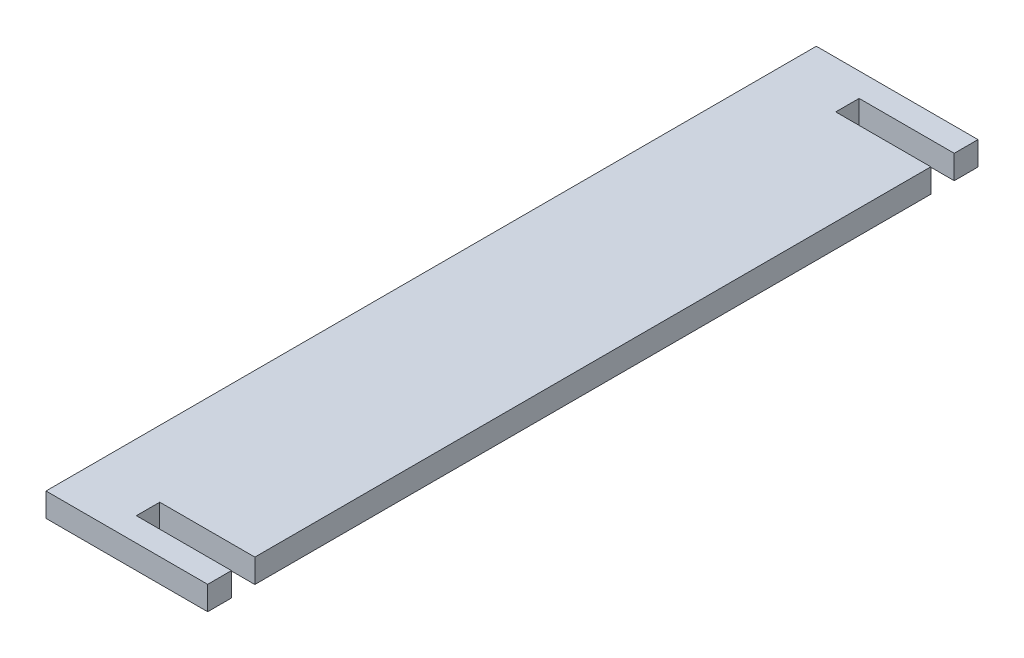
ISO-10303-21;
HEADER;
FILE_DESCRIPTION(('STEP AP214'),'2;1');
FILE_NAME('part.step','',(''),(''),'','','');
FILE_SCHEMA(('AUTOMOTIVE_DESIGN { 1 0 10303 214 1 1 1 1 }'));
ENDSEC;
DATA;
#1=APPLICATION_CONTEXT('core data for automotive mechanical design processes');
#2=APPLICATION_PROTOCOL_DEFINITION('international standard','automotive_design',2000,#1);
#3=PRODUCT_CONTEXT('',#1,'mechanical');
#4=PRODUCT('Part','Part','',(#3));
#5=PRODUCT_RELATED_PRODUCT_CATEGORY('part','',(#4));
#6=PRODUCT_DEFINITION_FORMATION('','',#4);
#7=PRODUCT_DEFINITION_CONTEXT('part definition',#1,'design');
#8=PRODUCT_DEFINITION('design','',#6,#7);
#9=PRODUCT_DEFINITION_SHAPE('','',#8);
#10=(LENGTH_UNIT() NAMED_UNIT(*) SI_UNIT(.MILLI.,.METRE.));
#11=(NAMED_UNIT(*) PLANE_ANGLE_UNIT() SI_UNIT($,.RADIAN.));
#12=(NAMED_UNIT(*) SI_UNIT($,.STERADIAN.) SOLID_ANGLE_UNIT());
#13=UNCERTAINTY_MEASURE_WITH_UNIT(LENGTH_MEASURE(1.E-05),#10,'distance_accuracy_value','');
#14=(GEOMETRIC_REPRESENTATION_CONTEXT(3) GLOBAL_UNCERTAINTY_ASSIGNED_CONTEXT((#13)) GLOBAL_UNIT_ASSIGNED_CONTEXT((#10,
#11,#12)) REPRESENTATION_CONTEXT('',''));
#15=CARTESIAN_POINT('',(0.,0.,0.));
#16=DIRECTION('',(0.,0.,1.));
#17=DIRECTION('',(1.,0.,0.));
#18=AXIS2_PLACEMENT_3D('',#15,#16,#17);
#19=CARTESIAN_POINT('',(0.,3.175,-102.87));
#20=DIRECTION('',(1.,0.,0.));
#21=DIRECTION('',(0.,0.,-1.));
#22=AXIS2_PLACEMENT_3D('',#19,#20,#21);
#23=PLANE('',#22);
#24=DIRECTION('',(0.,0.,1.));
#25=VECTOR('',#24,1.);
#26=CARTESIAN_POINT('',(0.,0.,-102.87));
#27=LINE('',#26,#25);
#28=CARTESIAN_POINT('',(0.,0.,-102.87));
#29=VERTEX_POINT('',#28);
#30=CARTESIAN_POINT('',(0.,0.,0.));
#31=VERTEX_POINT('',#30);
#32=EDGE_CURVE('E168',#29,#31,#27,.T.);
#33=ORIENTED_EDGE('',*,*,#32,.T.);
#34=DIRECTION('',(0.,-1.,0.));
#35=VECTOR('',#34,1.);
#36=CARTESIAN_POINT('',(0.,3.175,0.));
#37=LINE('',#36,#35);
#38=CARTESIAN_POINT('',(0.,3.175,0.));
#39=VERTEX_POINT('',#38);
#40=EDGE_CURVE('E11',#39,#31,#37,.T.);
#41=ORIENTED_EDGE('',*,*,#40,.F.);
#42=DIRECTION('',(0.,0.,1.));
#43=VECTOR('',#42,1.);
#44=CARTESIAN_POINT('',(0.,3.175,-102.87));
#45=LINE('',#44,#43);
#46=CARTESIAN_POINT('',(0.,3.175,-102.87));
#47=VERTEX_POINT('',#46);
#48=EDGE_CURVE('E202',#47,#39,#45,.T.);
#49=ORIENTED_EDGE('',*,*,#48,.F.);
#50=DIRECTION('',(0.,-1.,0.));
#51=VECTOR('',#50,1.);
#52=CARTESIAN_POINT('',(0.,3.175,-102.87));
#53=LINE('',#52,#51);
#54=EDGE_CURVE('E164',#47,#29,#53,.T.);
#55=ORIENTED_EDGE('',*,*,#54,.T.);
#56=EDGE_LOOP('',(#33,#41,#49,#55));
#57=FACE_BOUND('',#56,.T.);
#58=ADVANCED_FACE('F43',(#57),#23,.F.);
#59=CARTESIAN_POINT('',(0.,3.175,0.));
#60=DIRECTION('',(0.,0.,-1.));
#61=DIRECTION('',(-1.,0.,0.));
#62=AXIS2_PLACEMENT_3D('',#59,#60,#61);
#63=PLANE('',#62);
#64=DIRECTION('',(1.,0.,0.));
#65=VECTOR('',#64,1.);
#66=CARTESIAN_POINT('',(0.,0.,0.));
#67=LINE('',#66,#65);
#68=CARTESIAN_POINT('',(21.59,0.,0.));
#69=VERTEX_POINT('',#68);
#70=EDGE_CURVE('E172',#31,#69,#67,.T.);
#71=ORIENTED_EDGE('',*,*,#70,.T.);
#72=DIRECTION('',(0.,-1.,0.));
#73=VECTOR('',#72,1.);
#74=CARTESIAN_POINT('',(21.59,3.175,0.));
#75=LINE('',#74,#73);
#76=CARTESIAN_POINT('',(21.59,3.175,0.));
#77=VERTEX_POINT('',#76);
#78=EDGE_CURVE('E52',#77,#69,#75,.T.);
#79=ORIENTED_EDGE('',*,*,#78,.F.);
#80=DIRECTION('',(1.,0.,0.));
#81=VECTOR('',#80,1.);
#82=CARTESIAN_POINT('',(0.,3.175,0.));
#83=LINE('',#82,#81);
#84=EDGE_CURVE('E115',#39,#77,#83,.T.);
#85=ORIENTED_EDGE('',*,*,#84,.F.);
#86=ORIENTED_EDGE('',*,*,#40,.T.);
#87=EDGE_LOOP('',(#71,#79,#85,#86));
#88=FACE_BOUND('',#87,.T.);
#89=ADVANCED_FACE('F296',(#88),#63,.F.);
#90=CARTESIAN_POINT('',(21.59,3.175,0.));
#91=DIRECTION('',(-1.,0.,0.));
#92=DIRECTION('',(0.,0.,1.));
#93=AXIS2_PLACEMENT_3D('',#90,#91,#92);
#94=PLANE('',#93);
#95=DIRECTION('',(0.,0.,-1.));
#96=VECTOR('',#95,1.);
#97=CARTESIAN_POINT('',(21.59,0.,0.));
#98=LINE('',#97,#96);
#99=CARTESIAN_POINT('',(21.59,0.,-3.175));
#100=VERTEX_POINT('',#99);
#101=EDGE_CURVE('E175',#69,#100,#98,.T.);
#102=ORIENTED_EDGE('',*,*,#101,.T.);
#103=DIRECTION('',(0.,-1.,0.));
#104=VECTOR('',#103,1.);
#105=CARTESIAN_POINT('',(21.59,3.175,-3.175));
#106=LINE('',#105,#104);
#107=CARTESIAN_POINT('',(21.59,3.175,-3.175));
#108=VERTEX_POINT('',#107);
#109=EDGE_CURVE('E229',#108,#100,#106,.T.);
#110=ORIENTED_EDGE('',*,*,#109,.F.);
#111=DIRECTION('',(0.,0.,-1.));
#112=VECTOR('',#111,1.);
#113=CARTESIAN_POINT('',(21.59,3.175,0.));
#114=LINE('',#113,#112);
#115=EDGE_CURVE('E239',#77,#108,#114,.T.);
#116=ORIENTED_EDGE('',*,*,#115,.F.);
#117=ORIENTED_EDGE('',*,*,#78,.T.);
#118=EDGE_LOOP('',(#102,#110,#116,#117));
#119=FACE_BOUND('',#118,.T.);
#120=ADVANCED_FACE('F237',(#119),#94,.F.);
#121=CARTESIAN_POINT('',(21.59,3.175,-3.175));
#122=DIRECTION('',(0.,0.,1.));
#123=DIRECTION('',(1.,0.,0.));
#124=AXIS2_PLACEMENT_3D('',#121,#122,#123);
#125=PLANE('',#124);
#126=DIRECTION('',(-1.,0.,0.));
#127=VECTOR('',#126,1.);
#128=CARTESIAN_POINT('',(21.59,0.,-3.175));
#129=LINE('',#128,#127);
#130=CARTESIAN_POINT('',(8.89000000000001,0.,-3.175));
#131=VERTEX_POINT('',#130);
#132=EDGE_CURVE('E178',#100,#131,#129,.T.);
#133=ORIENTED_EDGE('',*,*,#132,.T.);
#134=DIRECTION('',(0.,-1.,0.));
#135=VECTOR('',#134,1.);
#136=CARTESIAN_POINT('',(8.89000000000001,3.175,-3.175));
#137=LINE('',#136,#135);
#138=CARTESIAN_POINT('',(8.89000000000001,3.175,-3.175));
#139=VERTEX_POINT('',#138);
#140=EDGE_CURVE('E225',#139,#131,#137,.T.);
#141=ORIENTED_EDGE('',*,*,#140,.F.);
#142=DIRECTION('',(-1.,0.,0.));
#143=VECTOR('',#142,1.);
#144=CARTESIAN_POINT('',(21.59,3.175,-3.175));
#145=LINE('',#144,#143);
#146=EDGE_CURVE('E258',#108,#139,#145,.T.);
#147=ORIENTED_EDGE('',*,*,#146,.F.);
#148=ORIENTED_EDGE('',*,*,#109,.T.);
#149=EDGE_LOOP('',(#133,#141,#147,#148));
#150=FACE_BOUND('',#149,.T.);
#151=ADVANCED_FACE('F248',(#150),#125,.F.);
#152=CARTESIAN_POINT('',(8.89000000000001,3.175,-3.175));
#153=DIRECTION('',(-1.,0.,0.));
#154=DIRECTION('',(0.,0.,1.));
#155=AXIS2_PLACEMENT_3D('',#152,#153,#154);
#156=PLANE('',#155);
#157=DIRECTION('',(0.,0.,-1.));
#158=VECTOR('',#157,1.);
#159=CARTESIAN_POINT('',(8.89000000000001,0.,-3.175));
#160=LINE('',#159,#158);
#161=CARTESIAN_POINT('',(8.89000000000001,0.,-6.2992));
#162=VERTEX_POINT('',#161);
#163=EDGE_CURVE('E181',#131,#162,#160,.T.);
#164=ORIENTED_EDGE('',*,*,#163,.T.);
#165=DIRECTION('',(0.,-1.,0.));
#166=VECTOR('',#165,1.);
#167=CARTESIAN_POINT('',(8.89000000000001,3.175,-6.2992));
#168=LINE('',#167,#166);
#169=CARTESIAN_POINT('',(8.89000000000001,3.175,-6.2992));
#170=VERTEX_POINT('',#169);
#171=EDGE_CURVE('E221',#170,#162,#168,.T.);
#172=ORIENTED_EDGE('',*,*,#171,.F.);
#173=DIRECTION('',(0.,0.,-1.));
#174=VECTOR('',#173,1.);
#175=CARTESIAN_POINT('',(8.89000000000001,3.175,-3.175));
#176=LINE('',#175,#174);
#177=EDGE_CURVE('E254',#139,#170,#176,.T.);
#178=ORIENTED_EDGE('',*,*,#177,.F.);
#179=ORIENTED_EDGE('',*,*,#140,.T.);
#180=EDGE_LOOP('',(#164,#172,#178,#179));
#181=FACE_BOUND('',#180,.T.);
#182=ADVANCED_FACE('F252',(#181),#156,.F.);
#183=CARTESIAN_POINT('',(8.89000000000001,3.175,-6.2992));
#184=DIRECTION('',(0.,0.,-1.));
#185=DIRECTION('',(-1.,0.,0.));
#186=AXIS2_PLACEMENT_3D('',#183,#184,#185);
#187=PLANE('',#186);
#188=DIRECTION('',(1.,0.,0.));
#189=VECTOR('',#188,1.);
#190=CARTESIAN_POINT('',(8.89000000000001,0.,-6.2992));
#191=LINE('',#190,#189);
#192=CARTESIAN_POINT('',(21.59,0.,-6.2992));
#193=VERTEX_POINT('',#192);
#194=EDGE_CURVE('E184',#162,#193,#191,.T.);
#195=ORIENTED_EDGE('',*,*,#194,.T.);
#196=DIRECTION('',(0.,-1.,0.));
#197=VECTOR('',#196,1.);
#198=CARTESIAN_POINT('',(21.59,3.175,-6.2992));
#199=LINE('',#198,#197);
#200=CARTESIAN_POINT('',(21.59,3.175,-6.2992));
#201=VERTEX_POINT('',#200);
#202=EDGE_CURVE('E217',#201,#193,#199,.T.);
#203=ORIENTED_EDGE('',*,*,#202,.F.);
#204=DIRECTION('',(1.,0.,0.));
#205=VECTOR('',#204,1.);
#206=CARTESIAN_POINT('',(8.89000000000001,3.175,-6.2992));
#207=LINE('',#206,#205);
#208=EDGE_CURVE('E257',#170,#201,#207,.T.);
#209=ORIENTED_EDGE('',*,*,#208,.F.);
#210=ORIENTED_EDGE('',*,*,#171,.T.);
#211=EDGE_LOOP('',(#195,#203,#209,#210));
#212=FACE_BOUND('',#211,.T.);
#213=ADVANCED_FACE('F309',(#212),#187,.F.);
#214=CARTESIAN_POINT('',(21.59,3.175,-6.2992));
#215=DIRECTION('',(-1.,0.,0.));
#216=DIRECTION('',(0.,0.,1.));
#217=AXIS2_PLACEMENT_3D('',#214,#215,#216);
#218=PLANE('',#217);
#219=DIRECTION('',(0.,0.,-1.));
#220=VECTOR('',#219,1.);
#221=CARTESIAN_POINT('',(21.59,0.,-6.2992));
#222=LINE('',#221,#220);
#223=CARTESIAN_POINT('',(21.59,0.,-96.5708));
#224=VERTEX_POINT('',#223);
#225=EDGE_CURVE('E187',#193,#224,#222,.T.);
#226=ORIENTED_EDGE('',*,*,#225,.T.);
#227=DIRECTION('',(0.,-1.,0.));
#228=VECTOR('',#227,1.);
#229=CARTESIAN_POINT('',(21.59,3.175,-96.5708));
#230=LINE('',#229,#228);
#231=CARTESIAN_POINT('',(21.59,3.175,-96.5708));
#232=VERTEX_POINT('',#231);
#233=EDGE_CURVE('E213',#232,#224,#230,.T.);
#234=ORIENTED_EDGE('',*,*,#233,.F.);
#235=DIRECTION('',(0.,0.,-1.));
#236=VECTOR('',#235,1.);
#237=CARTESIAN_POINT('',(21.59,3.175,-6.2992));
#238=LINE('',#237,#236);
#239=EDGE_CURVE('E262',#201,#232,#238,.T.);
#240=ORIENTED_EDGE('',*,*,#239,.F.);
#241=ORIENTED_EDGE('',*,*,#202,.T.);
#242=EDGE_LOOP('',(#226,#234,#240,#241));
#243=FACE_BOUND('',#242,.T.);
#244=ADVANCED_FACE('F312',(#243),#218,.F.);
#245=CARTESIAN_POINT('',(21.59,3.175,-96.5708));
#246=DIRECTION('',(0.,0.,1.));
#247=DIRECTION('',(1.,0.,0.));
#248=AXIS2_PLACEMENT_3D('',#245,#246,#247);
#249=PLANE('',#248);
#250=DIRECTION('',(-1.,0.,0.));
#251=VECTOR('',#250,1.);
#252=CARTESIAN_POINT('',(21.59,0.,-96.5708));
#253=LINE('',#252,#251);
#254=CARTESIAN_POINT('',(8.89,0.,-96.5708));
#255=VERTEX_POINT('',#254);
#256=EDGE_CURVE('E190',#224,#255,#253,.T.);
#257=ORIENTED_EDGE('',*,*,#256,.T.);
#258=DIRECTION('',(0.,-1.,0.));
#259=VECTOR('',#258,1.);
#260=CARTESIAN_POINT('',(8.89,3.175,-96.5708));
#261=LINE('',#260,#259);
#262=CARTESIAN_POINT('',(8.89,3.175,-96.5708));
#263=VERTEX_POINT('',#262);
#264=EDGE_CURVE('E209',#263,#255,#261,.T.);
#265=ORIENTED_EDGE('',*,*,#264,.F.);
#266=DIRECTION('',(-1.,0.,0.));
#267=VECTOR('',#266,1.);
#268=CARTESIAN_POINT('',(21.59,3.175,-96.5708));
#269=LINE('',#268,#267);
#270=EDGE_CURVE('E269',#232,#263,#269,.T.);
#271=ORIENTED_EDGE('',*,*,#270,.F.);
#272=ORIENTED_EDGE('',*,*,#233,.T.);
#273=EDGE_LOOP('',(#257,#265,#271,#272));
#274=FACE_BOUND('',#273,.T.);
#275=ADVANCED_FACE('F277',(#274),#249,.F.);
#276=CARTESIAN_POINT('',(8.89,3.175,-96.5708));
#277=DIRECTION('',(-1.,0.,0.));
#278=DIRECTION('',(0.,0.,1.));
#279=AXIS2_PLACEMENT_3D('',#276,#277,#278);
#280=PLANE('',#279);
#281=DIRECTION('',(0.,0.,-1.));
#282=VECTOR('',#281,1.);
#283=CARTESIAN_POINT('',(8.89,0.,-96.5708));
#284=LINE('',#283,#282);
#285=CARTESIAN_POINT('',(8.89,0.,-99.695));
#286=VERTEX_POINT('',#285);
#287=EDGE_CURVE('E193',#255,#286,#284,.T.);
#288=ORIENTED_EDGE('',*,*,#287,.T.);
#289=DIRECTION('',(0.,-1.,0.));
#290=VECTOR('',#289,1.);
#291=CARTESIAN_POINT('',(8.89,3.175,-99.695));
#292=LINE('',#291,#290);
#293=CARTESIAN_POINT('',(8.89,3.175,-99.695));
#294=VERTEX_POINT('',#293);
#295=EDGE_CURVE('E157',#294,#286,#292,.T.);
#296=ORIENTED_EDGE('',*,*,#295,.F.);
#297=DIRECTION('',(0.,0.,-1.));
#298=VECTOR('',#297,1.);
#299=CARTESIAN_POINT('',(8.89,3.175,-96.5708));
#300=LINE('',#299,#298);
#301=EDGE_CURVE('E146',#263,#294,#300,.T.);
#302=ORIENTED_EDGE('',*,*,#301,.F.);
#303=ORIENTED_EDGE('',*,*,#264,.T.);
#304=EDGE_LOOP('',(#288,#296,#302,#303));
#305=FACE_BOUND('',#304,.T.);
#306=ADVANCED_FACE('F281',(#305),#280,.F.);
#307=CARTESIAN_POINT('',(8.89,3.175,-99.695));
#308=DIRECTION('',(0.,0.,-1.));
#309=DIRECTION('',(-1.,0.,0.));
#310=AXIS2_PLACEMENT_3D('',#307,#308,#309);
#311=PLANE('',#310);
#312=DIRECTION('',(1.,0.,0.));
#313=VECTOR('',#312,1.);
#314=CARTESIAN_POINT('',(8.89,0.,-99.695));
#315=LINE('',#314,#313);
#316=CARTESIAN_POINT('',(21.59,0.,-99.695));
#317=VERTEX_POINT('',#316);
#318=EDGE_CURVE('E155',#286,#317,#315,.T.);
#319=ORIENTED_EDGE('',*,*,#318,.T.);
#320=DIRECTION('',(0.,-1.,0.));
#321=VECTOR('',#320,1.);
#322=CARTESIAN_POINT('',(21.59,3.175,-99.695));
#323=LINE('',#322,#321);
#324=CARTESIAN_POINT('',(21.59,3.175,-99.695));
#325=VERTEX_POINT('',#324);
#326=EDGE_CURVE('E152',#325,#317,#323,.T.);
#327=ORIENTED_EDGE('',*,*,#326,.F.);
#328=DIRECTION('',(1.,0.,0.));
#329=VECTOR('',#328,1.);
#330=CARTESIAN_POINT('',(8.89,3.175,-99.695));
#331=LINE('',#330,#329);
#332=EDGE_CURVE('E140',#294,#325,#331,.T.);
#333=ORIENTED_EDGE('',*,*,#332,.F.);
#334=ORIENTED_EDGE('',*,*,#295,.T.);
#335=EDGE_LOOP('',(#319,#327,#333,#334));
#336=FACE_BOUND('',#335,.T.);
#337=ADVANCED_FACE('F153',(#336),#311,.F.);
#338=CARTESIAN_POINT('',(21.59,3.175,-99.695));
#339=DIRECTION('',(-1.,0.,0.));
#340=DIRECTION('',(0.,0.,1.));
#341=AXIS2_PLACEMENT_3D('',#338,#339,#340);
#342=PLANE('',#341);
#343=DIRECTION('',(0.,0.,-1.));
#344=VECTOR('',#343,1.);
#345=CARTESIAN_POINT('',(21.59,0.,-99.695));
#346=LINE('',#345,#344);
#347=CARTESIAN_POINT('',(21.59,0.,-102.87));
#348=VERTEX_POINT('',#347);
#349=EDGE_CURVE('E101',#317,#348,#346,.T.);
#350=ORIENTED_EDGE('',*,*,#349,.T.);
#351=DIRECTION('',(0.,-1.,0.));
#352=VECTOR('',#351,1.);
#353=CARTESIAN_POINT('',(21.59,3.175,-102.87));
#354=LINE('',#353,#352);
#355=CARTESIAN_POINT('',(21.59,3.175,-102.87));
#356=VERTEX_POINT('',#355);
#357=EDGE_CURVE('E158',#356,#348,#354,.T.);
#358=ORIENTED_EDGE('',*,*,#357,.F.);
#359=DIRECTION('',(0.,0.,-1.));
#360=VECTOR('',#359,1.);
#361=CARTESIAN_POINT('',(21.59,3.175,-99.695));
#362=LINE('',#361,#360);
#363=EDGE_CURVE('E144',#325,#356,#362,.T.);
#364=ORIENTED_EDGE('',*,*,#363,.F.);
#365=ORIENTED_EDGE('',*,*,#326,.T.);
#366=EDGE_LOOP('',(#350,#358,#364,#365));
#367=FACE_BOUND('',#366,.T.);
#368=ADVANCED_FACE('F160',(#367),#342,.F.);
#369=CARTESIAN_POINT('',(21.59,3.175,-102.87));
#370=DIRECTION('',(0.,0.,1.));
#371=DIRECTION('',(1.,0.,0.));
#372=AXIS2_PLACEMENT_3D('',#369,#370,#371);
#373=PLANE('',#372);
#374=DIRECTION('',(-1.,0.,0.));
#375=VECTOR('',#374,1.);
#376=CARTESIAN_POINT('',(21.59,0.,-102.87));
#377=LINE('',#376,#375);
#378=EDGE_CURVE('E107',#348,#29,#377,.T.);
#379=ORIENTED_EDGE('',*,*,#378,.T.);
#380=ORIENTED_EDGE('',*,*,#54,.F.);
#381=DIRECTION('',(-1.,0.,0.));
#382=VECTOR('',#381,1.);
#383=CARTESIAN_POINT('',(21.59,3.175,-102.87));
#384=LINE('',#383,#382);
#385=EDGE_CURVE('E60',#356,#47,#384,.T.);
#386=ORIENTED_EDGE('',*,*,#385,.F.);
#387=ORIENTED_EDGE('',*,*,#357,.T.);
#388=EDGE_LOOP('',(#379,#380,#386,#387));
#389=FACE_BOUND('',#388,.T.);
#390=ADVANCED_FACE('F285',(#389),#373,.F.);
#391=CARTESIAN_POINT('',(0.,3.175,0.));
#392=DIRECTION('',(0.,1.,0.));
#393=DIRECTION('',(0.,0.,1.));
#394=AXIS2_PLACEMENT_3D('',#391,#392,#393);
#395=PLANE('',#394);
#396=ORIENTED_EDGE('',*,*,#48,.T.);
#397=ORIENTED_EDGE('',*,*,#84,.T.);
#398=ORIENTED_EDGE('',*,*,#115,.T.);
#399=ORIENTED_EDGE('',*,*,#146,.T.);
#400=ORIENTED_EDGE('',*,*,#177,.T.);
#401=ORIENTED_EDGE('',*,*,#208,.T.);
#402=ORIENTED_EDGE('',*,*,#239,.T.);
#403=ORIENTED_EDGE('',*,*,#270,.T.);
#404=ORIENTED_EDGE('',*,*,#301,.T.);
#405=ORIENTED_EDGE('',*,*,#332,.T.);
#406=ORIENTED_EDGE('',*,*,#363,.T.);
#407=ORIENTED_EDGE('',*,*,#385,.T.);
#408=EDGE_LOOP('',(#396,#397,#398,#399,#400,#401,#402,#403,#404,#405,#406,#407));
#409=FACE_BOUND('',#408,.T.);
#410=ADVANCED_FACE('F142',(#409),#395,.T.);
#411=CARTESIAN_POINT('',(0.,0.,0.));
#412=DIRECTION('',(0.,1.,0.));
#413=DIRECTION('',(0.,0.,1.));
#414=AXIS2_PLACEMENT_3D('',#411,#412,#413);
#415=PLANE('',#414);
#416=ORIENTED_EDGE('',*,*,#32,.F.);
#417=ORIENTED_EDGE('',*,*,#378,.F.);
#418=ORIENTED_EDGE('',*,*,#349,.F.);
#419=ORIENTED_EDGE('',*,*,#318,.F.);
#420=ORIENTED_EDGE('',*,*,#287,.F.);
#421=ORIENTED_EDGE('',*,*,#256,.F.);
#422=ORIENTED_EDGE('',*,*,#225,.F.);
#423=ORIENTED_EDGE('',*,*,#194,.F.);
#424=ORIENTED_EDGE('',*,*,#163,.F.);
#425=ORIENTED_EDGE('',*,*,#132,.F.);
#426=ORIENTED_EDGE('',*,*,#101,.F.);
#427=ORIENTED_EDGE('',*,*,#70,.F.);
#428=EDGE_LOOP('',(#416,#417,#418,#419,#420,#421,#422,#423,#424,#425,#426,#427));
#429=FACE_BOUND('',#428,.T.);
#430=ADVANCED_FACE('F243',(#429),#415,.F.);
#431=CLOSED_SHELL('',(#58,#89,#120,#151,#182,#213,#244,#275,#306,#337,#368,#390,#410,#430));
#432=MANIFOLD_SOLID_BREP('B2',#431);
#433=ADVANCED_BREP_SHAPE_REPRESENTATION('',(#18,#432),#14);
#434=SHAPE_DEFINITION_REPRESENTATION(#9,#433);
ENDSEC;
END-ISO-10303-21;
